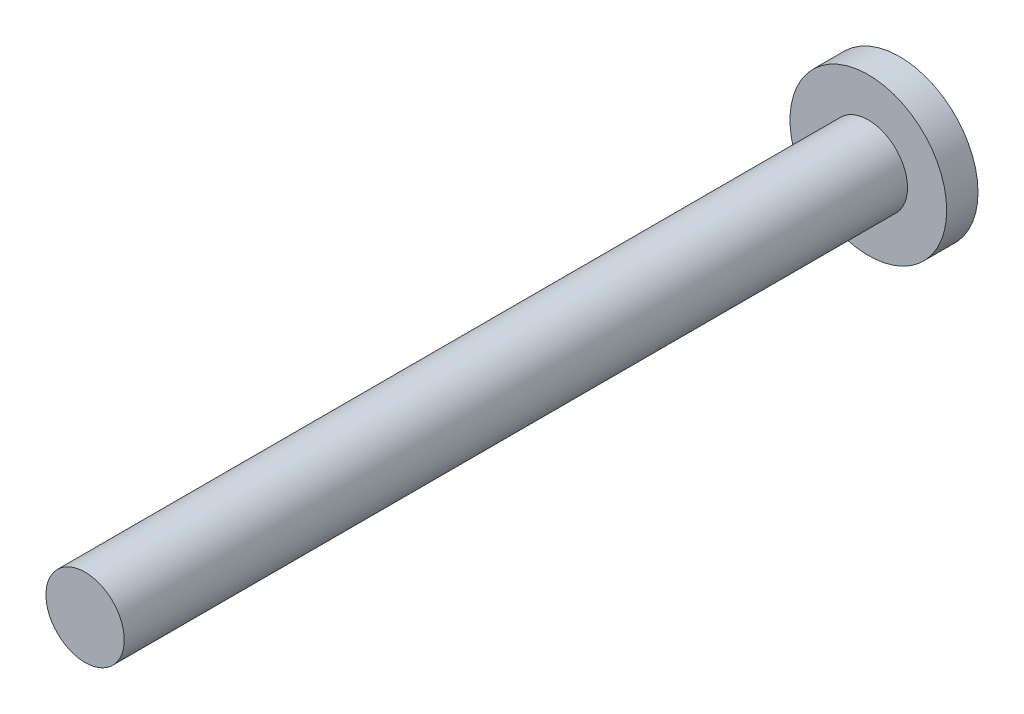
ISO-10303-21;
HEADER;
FILE_DESCRIPTION(('STEP AP214'),'2;1');
FILE_NAME('part.step','',(''),(''),'','','');
FILE_SCHEMA(('AUTOMOTIVE_DESIGN { 1 0 10303 214 1 1 1 1 }'));
ENDSEC;
DATA;
#1=APPLICATION_CONTEXT('core data for automotive mechanical design processes');
#2=APPLICATION_PROTOCOL_DEFINITION('international standard','automotive_design',2000,#1);
#3=PRODUCT_CONTEXT('',#1,'mechanical');
#4=PRODUCT('Part','Part','',(#3));
#5=PRODUCT_RELATED_PRODUCT_CATEGORY('part','',(#4));
#6=PRODUCT_DEFINITION_FORMATION('','',#4);
#7=PRODUCT_DEFINITION_CONTEXT('part definition',#1,'design');
#8=PRODUCT_DEFINITION('design','',#6,#7);
#9=PRODUCT_DEFINITION_SHAPE('','',#8);
#10=(LENGTH_UNIT() NAMED_UNIT(*) SI_UNIT(.MILLI.,.METRE.));
#11=(NAMED_UNIT(*) PLANE_ANGLE_UNIT() SI_UNIT($,.RADIAN.));
#12=(NAMED_UNIT(*) SI_UNIT($,.STERADIAN.) SOLID_ANGLE_UNIT());
#13=UNCERTAINTY_MEASURE_WITH_UNIT(LENGTH_MEASURE(1.E-05),#10,'distance_accuracy_value','');
#14=(GEOMETRIC_REPRESENTATION_CONTEXT(3) GLOBAL_UNCERTAINTY_ASSIGNED_CONTEXT((#13)) GLOBAL_UNIT_ASSIGNED_CONTEXT((#10,
#11,#12)) REPRESENTATION_CONTEXT('',''));
#15=CARTESIAN_POINT('',(0.,0.,0.));
#16=DIRECTION('',(0.,0.,1.));
#17=DIRECTION('',(1.,0.,0.));
#18=AXIS2_PLACEMENT_3D('',#15,#16,#17);
#19=CARTESIAN_POINT('',(2.5,0.,0.));
#20=DIRECTION('',(0.,0.,1.));
#21=DIRECTION('',(1.,0.,0.));
#22=AXIS2_PLACEMENT_3D('',#19,#20,#21);
#23=PLANE('',#22);
#24=CARTESIAN_POINT('',(0.,0.,0.));
#25=DIRECTION('',(0.,0.,1.));
#26=DIRECTION('',(1.,0.,0.));
#27=AXIS2_PLACEMENT_3D('',#24,#25,#26);
#28=CIRCLE('',#27,2.5);
#29=CARTESIAN_POINT('',(2.5,0.,0.));
#30=VERTEX_POINT('',#29);
#31=EDGE_CURVE('E45',#30,#30,#28,.T.);
#32=ORIENTED_EDGE('',*,*,#31,.T.);
#33=EDGE_LOOP('',(#32));
#34=FACE_BOUND('',#33,.T.);
#35=ADVANCED_FACE('F31',(#34),#23,.T.);
#36=CARTESIAN_POINT('',(0.,0.,-52.));
#37=DIRECTION('',(0.,0.,-1.));
#38=DIRECTION('',(-1.,0.,0.));
#39=AXIS2_PLACEMENT_3D('',#36,#37,#38);
#40=PLANE('',#39);
#41=CARTESIAN_POINT('',(0.,0.,-52.));
#42=DIRECTION('',(0.,0.,1.));
#43=DIRECTION('',(1.,0.,0.));
#44=AXIS2_PLACEMENT_3D('',#41,#42,#43);
#45=CIRCLE('',#44,5.);
#46=CARTESIAN_POINT('',(4.99999999999999,0.,-52.));
#47=VERTEX_POINT('',#46);
#48=EDGE_CURVE('E10',#47,#47,#45,.T.);
#49=ORIENTED_EDGE('',*,*,#48,.F.);
#50=EDGE_LOOP('',(#49));
#51=FACE_BOUND('',#50,.T.);
#52=ADVANCED_FACE('F63',(#51),#40,.T.);
#53=CARTESIAN_POINT('',(0.,0.,0.));
#54=DIRECTION('',(0.,0.,1.));
#55=DIRECTION('',(1.,0.,0.));
#56=AXIS2_PLACEMENT_3D('',#53,#54,#55);
#57=CYLINDRICAL_SURFACE('',#56,5.);
#58=ORIENTED_EDGE('',*,*,#48,.T.);
#59=EDGE_LOOP('',(#58));
#60=FACE_BOUND('',#59,.T.);
#61=CARTESIAN_POINT('',(0.,0.,-50.));
#62=DIRECTION('',(0.,0.,1.));
#63=DIRECTION('',(1.,0.,0.));
#64=AXIS2_PLACEMENT_3D('',#61,#62,#63);
#65=CIRCLE('',#64,5.);
#66=CARTESIAN_POINT('',(4.99999999999999,0.,-50.));
#67=VERTEX_POINT('',#66);
#68=EDGE_CURVE('E37',#67,#67,#65,.T.);
#69=ORIENTED_EDGE('',*,*,#68,.F.);
#70=EDGE_LOOP('',(#69));
#71=FACE_BOUND('',#70,.T.);
#72=ADVANCED_FACE('F60',(#60,#71),#57,.T.);
#73=CARTESIAN_POINT('',(4.99999999999999,0.,-50.));
#74=DIRECTION('',(0.,0.,1.));
#75=DIRECTION('',(1.,0.,0.));
#76=AXIS2_PLACEMENT_3D('',#73,#74,#75);
#77=PLANE('',#76);
#78=ORIENTED_EDGE('',*,*,#68,.T.);
#79=EDGE_LOOP('',(#78));
#80=FACE_BOUND('',#79,.T.);
#81=CARTESIAN_POINT('',(0.,0.,-50.));
#82=DIRECTION('',(0.,0.,1.));
#83=DIRECTION('',(1.,0.,0.));
#84=AXIS2_PLACEMENT_3D('',#81,#82,#83);
#85=CIRCLE('',#84,2.50000000000001);
#86=CARTESIAN_POINT('',(2.49999999999999,0.,-50.));
#87=VERTEX_POINT('',#86);
#88=EDGE_CURVE('E41',#87,#87,#85,.T.);
#89=ORIENTED_EDGE('',*,*,#88,.F.);
#90=EDGE_LOOP('',(#89));
#91=FACE_BOUND('',#90,.T.);
#92=ADVANCED_FACE('F54',(#80,#91),#77,.T.);
#93=CARTESIAN_POINT('',(0.,0.,0.));
#94=DIRECTION('',(0.,0.,1.));
#95=DIRECTION('',(1.,0.,0.));
#96=AXIS2_PLACEMENT_3D('',#93,#94,#95);
#97=CYLINDRICAL_SURFACE('',#96,2.5);
#98=ORIENTED_EDGE('',*,*,#88,.T.);
#99=EDGE_LOOP('',(#98));
#100=FACE_BOUND('',#99,.T.);
#101=ORIENTED_EDGE('',*,*,#31,.F.);
#102=EDGE_LOOP('',(#101));
#103=FACE_BOUND('',#102,.T.);
#104=ADVANCED_FACE('F52',(#100,#103),#97,.T.);
#105=CLOSED_SHELL('',(#35,#52,#72,#92,#104));
#106=MANIFOLD_SOLID_BREP('B2',#105);
#107=ADVANCED_BREP_SHAPE_REPRESENTATION('',(#18,#106),#14);
#108=SHAPE_DEFINITION_REPRESENTATION(#9,#107);
ENDSEC;
END-ISO-10303-21;
